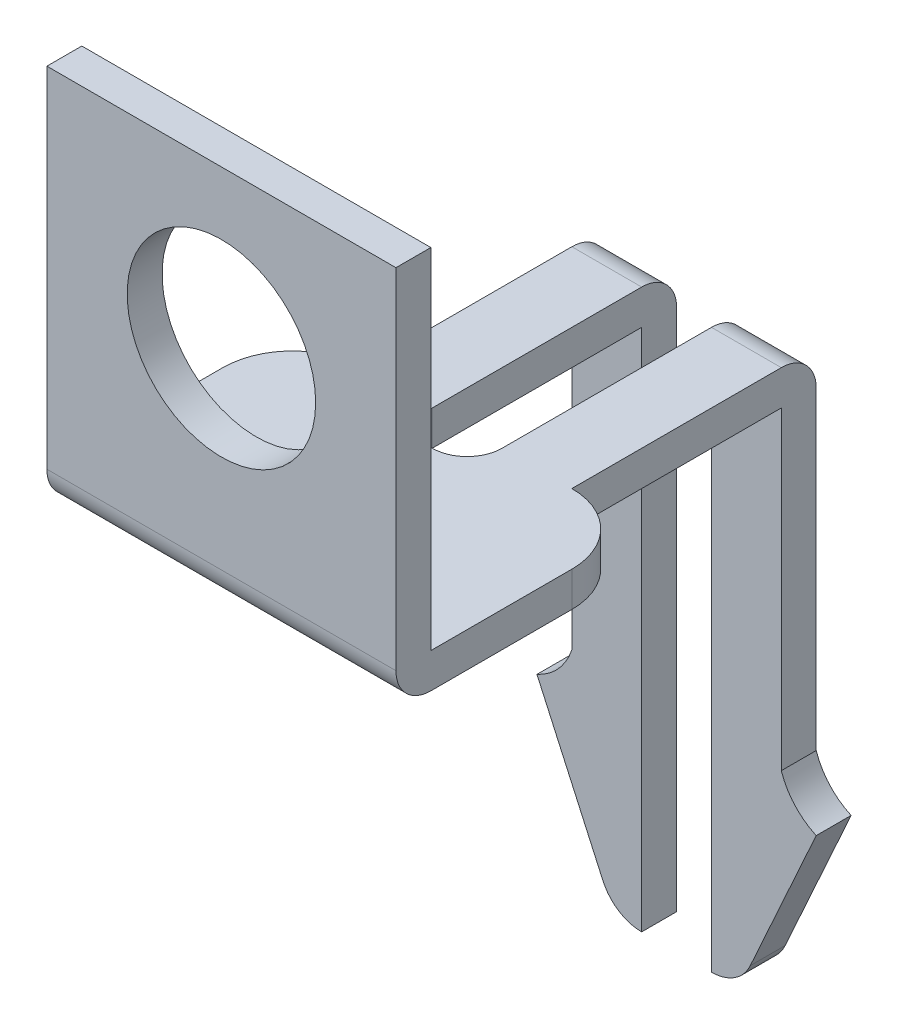
ISO-10303-21;
HEADER;
FILE_DESCRIPTION(('STEP AP214'),'2;1');
FILE_NAME('part.step','',(''),(''),'','','');
FILE_SCHEMA(('AUTOMOTIVE_DESIGN { 1 0 10303 214 1 1 1 1 }'));
ENDSEC;
DATA;
#1=APPLICATION_CONTEXT('core data for automotive mechanical design processes');
#2=APPLICATION_PROTOCOL_DEFINITION('international standard','automotive_design',2000,#1);
#3=PRODUCT_CONTEXT('',#1,'mechanical');
#4=PRODUCT('Part','Part','',(#3));
#5=PRODUCT_RELATED_PRODUCT_CATEGORY('part','',(#4));
#6=PRODUCT_DEFINITION_FORMATION('','',#4);
#7=PRODUCT_DEFINITION_CONTEXT('part definition',#1,'design');
#8=PRODUCT_DEFINITION('design','',#6,#7);
#9=PRODUCT_DEFINITION_SHAPE('','',#8);
#10=(LENGTH_UNIT() NAMED_UNIT(*) SI_UNIT(.MILLI.,.METRE.));
#11=(NAMED_UNIT(*) PLANE_ANGLE_UNIT() SI_UNIT($,.RADIAN.));
#12=(NAMED_UNIT(*) SI_UNIT($,.STERADIAN.) SOLID_ANGLE_UNIT());
#13=UNCERTAINTY_MEASURE_WITH_UNIT(LENGTH_MEASURE(1.E-05),#10,'distance_accuracy_value','');
#14=(GEOMETRIC_REPRESENTATION_CONTEXT(3) GLOBAL_UNCERTAINTY_ASSIGNED_CONTEXT((#13)) GLOBAL_UNIT_ASSIGNED_CONTEXT((#10,
#11,#12)) REPRESENTATION_CONTEXT('',''));
#15=CARTESIAN_POINT('',(0.,0.,0.));
#16=DIRECTION('',(0.,0.,1.));
#17=DIRECTION('',(1.,0.,0.));
#18=AXIS2_PLACEMENT_3D('',#15,#16,#17);
#19=CARTESIAN_POINT('',(0.,0.,-7.02));
#20=DIRECTION('',(0.,0.,1.));
#21=DIRECTION('',(1.,0.,0.));
#22=AXIS2_PLACEMENT_3D('',#19,#20,#21);
#23=PLANE('',#22);
#24=CARTESIAN_POINT('',(2.38440198337204,-6.9561141946464,-7.02));
#25=DIRECTION('',(0.,0.,1.));
#26=DIRECTION('',(-1.,0.,0.));
#27=AXIS2_PLACEMENT_3D('',#24,#25,#26);
#28=CIRCLE('',#27,0.931952646211558);
#29=CARTESIAN_POINT('',(1.5,-7.25,-7.02));
#30=VERTEX_POINT('',#29);
#31=CARTESIAN_POINT('',(1.99999999999999,-7.80509643825363,-7.02));
#32=VERTEX_POINT('',#31);
#33=EDGE_CURVE('E224',#30,#32,#28,.T.);
#34=ORIENTED_EDGE('',*,*,#33,.T.);
#35=DIRECTION('',(-0.412469437084235,-0.91097143943782,0.));
#36=VECTOR('',#35,1.);
#37=CARTESIAN_POINT('',(1.05509643825363,-9.89199083668204,-7.02));
#38=LINE('',#37,#36);
#39=CARTESIAN_POINT('',(1.05509643825363,-9.89199083668204,-7.02));
#40=VERTEX_POINT('',#39);
#41=EDGE_CURVE('E223',#32,#40,#38,.T.);
#42=ORIENTED_EDGE('',*,*,#41,.T.);
#43=CARTESIAN_POINT('',(0.499999999999999,-9.6406544001026,-7.02));
#44=DIRECTION('',(0.,0.,-1.));
#45=DIRECTION('',(1.,0.,0.));
#46=AXIS2_PLACEMENT_3D('',#43,#44,#45);
#47=CIRCLE('',#46,0.609345599897395);
#48=CARTESIAN_POINT('',(0.499999999999999,-10.25,-7.02));
#49=VERTEX_POINT('',#48);
#50=EDGE_CURVE('E207',#40,#49,#47,.T.);
#51=ORIENTED_EDGE('',*,*,#50,.T.);
#52=DIRECTION('',(0.,1.,0.));
#53=VECTOR('',#52,1.);
#54=CARTESIAN_POINT('',(0.5,-2.75,-7.02));
#55=LINE('',#54,#53);
#56=CARTESIAN_POINT('',(0.5,-2.75,-7.02));
#57=VERTEX_POINT('',#56);
#58=EDGE_CURVE('E220',#49,#57,#55,.T.);
#59=ORIENTED_EDGE('',*,*,#58,.T.);
#60=DIRECTION('',(1.,0.,0.));
#61=VECTOR('',#60,1.);
#62=CARTESIAN_POINT('',(0.,-2.75,-7.02));
#63=LINE('',#62,#61);
#64=CARTESIAN_POINT('',(1.5,-2.75,-7.02));
#65=VERTEX_POINT('',#64);
#66=EDGE_CURVE('E280',#57,#65,#63,.T.);
#67=ORIENTED_EDGE('',*,*,#66,.T.);
#68=DIRECTION('',(0.,1.,0.));
#69=VECTOR('',#68,1.);
#70=CARTESIAN_POINT('',(1.5,-2.75,-7.02));
#71=LINE('',#70,#69);
#72=EDGE_CURVE('E284',#30,#65,#71,.T.);
#73=ORIENTED_EDGE('',*,*,#72,.F.);
#74=EDGE_LOOP('',(#34,#42,#51,#59,#67,#73));
#75=FACE_BOUND('',#74,.T.);
#76=ADVANCED_FACE('F35',(#75),#23,.F.);
#77=CARTESIAN_POINT('',(1.5,-10.25,-6.52));
#78=DIRECTION('',(0.,0.,1.));
#79=DIRECTION('',(1.,0.,0.));
#80=AXIS2_PLACEMENT_3D('',#77,#78,#79);
#81=PLANE('',#80);
#82=DIRECTION('',(0.412469437084235,0.910971439437821,0.));
#83=VECTOR('',#82,1.);
#84=CARTESIAN_POINT('',(0.996267159368278,-10.02191996124,-6.52));
#85=LINE('',#84,#83);
#86=CARTESIAN_POINT('',(1.05509643825363,-9.89199083668204,-6.52));
#87=VERTEX_POINT('',#86);
#88=CARTESIAN_POINT('',(1.99999999999999,-7.80509643825363,-6.52));
#89=VERTEX_POINT('',#88);
#90=EDGE_CURVE('E11',#87,#89,#85,.T.);
#91=ORIENTED_EDGE('',*,*,#90,.T.);
#92=CARTESIAN_POINT('',(2.38440198337204,-6.9561141946464,-6.52));
#93=DIRECTION('',(0.,0.,1.));
#94=DIRECTION('',(1.,0.,0.));
#95=AXIS2_PLACEMENT_3D('',#92,#93,#94);
#96=CIRCLE('',#95,0.931952646211558);
#97=CARTESIAN_POINT('',(1.5,-7.25,-6.52));
#98=VERTEX_POINT('',#97);
#99=EDGE_CURVE('E547',#89,#98,#96,.F.);
#100=ORIENTED_EDGE('',*,*,#99,.T.);
#101=DIRECTION('',(0.,1.,0.));
#102=VECTOR('',#101,1.);
#103=CARTESIAN_POINT('',(1.5,-10.25,-6.52));
#104=LINE('',#103,#102);
#105=CARTESIAN_POINT('',(1.5,-2.75,-6.52));
#106=VERTEX_POINT('',#105);
#107=EDGE_CURVE('E339',#98,#106,#104,.T.);
#108=ORIENTED_EDGE('',*,*,#107,.T.);
#109=DIRECTION('',(1.,0.,0.));
#110=VECTOR('',#109,1.);
#111=CARTESIAN_POINT('',(1.5,-2.75,-6.52));
#112=LINE('',#111,#110);
#113=CARTESIAN_POINT('',(0.5,-2.75,-6.52));
#114=VERTEX_POINT('',#113);
#115=EDGE_CURVE('E215',#114,#106,#112,.T.);
#116=ORIENTED_EDGE('',*,*,#115,.F.);
#117=DIRECTION('',(0.,1.,0.));
#118=VECTOR('',#117,1.);
#119=CARTESIAN_POINT('',(0.499999999999999,-10.25,-6.52));
#120=LINE('',#119,#118);
#121=CARTESIAN_POINT('',(0.499999999999999,-10.25,-6.52));
#122=VERTEX_POINT('',#121);
#123=EDGE_CURVE('E214',#122,#114,#120,.T.);
#124=ORIENTED_EDGE('',*,*,#123,.F.);
#125=CARTESIAN_POINT('',(0.499999999999999,-9.6406544001026,-6.52));
#126=DIRECTION('',(0.,0.,1.));
#127=DIRECTION('',(1.,0.,0.));
#128=AXIS2_PLACEMENT_3D('',#125,#126,#127);
#129=CIRCLE('',#128,0.609345599897395);
#130=EDGE_CURVE('E210',#122,#87,#129,.T.);
#131=ORIENTED_EDGE('',*,*,#130,.T.);
#132=EDGE_LOOP('',(#91,#100,#108,#116,#124,#131));
#133=FACE_BOUND('',#132,.T.);
#134=ADVANCED_FACE('F301',(#133),#81,.T.);
#135=CARTESIAN_POINT('',(1.5,-2.75,-7.02));
#136=DIRECTION('',(-1.,0.,0.));
#137=DIRECTION('',(0.,0.,1.));
#138=AXIS2_PLACEMENT_3D('',#135,#136,#137);
#139=PLANE('',#138);
#140=DIRECTION('',(0.,0.,1.));
#141=VECTOR('',#140,1.);
#142=CARTESIAN_POINT('',(1.5,-7.25,-7.02));
#143=LINE('',#142,#141);
#144=EDGE_CURVE('E493',#30,#98,#143,.T.);
#145=ORIENTED_EDGE('',*,*,#144,.F.);
#146=ORIENTED_EDGE('',*,*,#72,.T.);
#147=CARTESIAN_POINT('',(1.5,-2.75,-6.52));
#148=DIRECTION('',(-1.,0.,0.));
#149=DIRECTION('',(0.,0.,1.));
#150=AXIS2_PLACEMENT_3D('',#147,#148,#149);
#151=CIRCLE('',#150,0.5);
#152=CARTESIAN_POINT('',(1.5,-2.25,-6.52));
#153=VERTEX_POINT('',#152);
#154=EDGE_CURVE('E58',#65,#153,#151,.F.);
#155=ORIENTED_EDGE('',*,*,#154,.T.);
#156=DIRECTION('',(0.,0.,1.));
#157=VECTOR('',#156,1.);
#158=CARTESIAN_POINT('',(1.5,-2.25,-7.02));
#159=LINE('',#158,#157);
#160=CARTESIAN_POINT('',(1.5,-2.25,-3.52));
#161=VERTEX_POINT('',#160);
#162=EDGE_CURVE('E375',#153,#161,#159,.T.);
#163=ORIENTED_EDGE('',*,*,#162,.T.);
#164=DIRECTION('',(0.,1.,0.));
#165=VECTOR('',#164,1.);
#166=CARTESIAN_POINT('',(1.5,-2.75,-3.52));
#167=LINE('',#166,#165);
#168=CARTESIAN_POINT('',(1.5,-2.75,-3.52));
#169=VERTEX_POINT('',#168);
#170=EDGE_CURVE('E392',#169,#161,#167,.T.);
#171=ORIENTED_EDGE('',*,*,#170,.F.);
#172=DIRECTION('',(0.,0.,1.));
#173=VECTOR('',#172,1.);
#174=CARTESIAN_POINT('',(1.5,-2.75,-7.02));
#175=LINE('',#174,#173);
#176=EDGE_CURVE('E380',#106,#169,#175,.T.);
#177=ORIENTED_EDGE('',*,*,#176,.F.);
#178=ORIENTED_EDGE('',*,*,#107,.F.);
#179=EDGE_LOOP('',(#145,#146,#155,#163,#171,#177,#178));
#180=FACE_BOUND('',#179,.T.);
#181=ADVANCED_FACE('F307',(#180),#139,.F.);
#182=CARTESIAN_POINT('',(-2.5,-2.75,-0.5));
#183=DIRECTION('',(0.,-1.,0.));
#184=DIRECTION('',(1.,0.,0.));
#185=AXIS2_PLACEMENT_3D('',#182,#183,#184);
#186=PLANE('',#185);
#187=ORIENTED_EDGE('',*,*,#115,.T.);
#188=ORIENTED_EDGE('',*,*,#176,.T.);
#189=CARTESIAN_POINT('',(1.5,-2.75,-2.52));
#190=DIRECTION('',(0.,-1.,0.));
#191=DIRECTION('',(0.,0.,-1.));
#192=AXIS2_PLACEMENT_3D('',#189,#190,#191);
#193=CIRCLE('',#192,1.);
#194=CARTESIAN_POINT('',(2.5,-2.75,-2.52));
#195=VERTEX_POINT('',#194);
#196=EDGE_CURVE('E382',#169,#195,#193,.T.);
#197=ORIENTED_EDGE('',*,*,#196,.T.);
#198=DIRECTION('',(0.,0.,1.));
#199=VECTOR('',#198,1.);
#200=CARTESIAN_POINT('',(2.5,-2.75,-0.5));
#201=LINE('',#200,#199);
#202=CARTESIAN_POINT('',(2.5,-2.75,-0.5));
#203=VERTEX_POINT('',#202);
#204=EDGE_CURVE('E458',#195,#203,#201,.T.);
#205=ORIENTED_EDGE('',*,*,#204,.T.);
#206=DIRECTION('',(1.,0.,0.));
#207=VECTOR('',#206,1.);
#208=CARTESIAN_POINT('',(-2.5,-2.75,-0.5));
#209=LINE('',#208,#207);
#210=CARTESIAN_POINT('',(-2.5,-2.75,-0.5));
#211=VERTEX_POINT('',#210);
#212=EDGE_CURVE('E466',#203,#211,#209,.F.);
#213=ORIENTED_EDGE('',*,*,#212,.T.);
#214=DIRECTION('',(0.,0.,1.));
#215=VECTOR('',#214,1.);
#216=CARTESIAN_POINT('',(-2.5,-2.75,-0.5));
#217=LINE('',#216,#215);
#218=CARTESIAN_POINT('',(-2.5,-2.75,-2.52));
#219=VERTEX_POINT('',#218);
#220=EDGE_CURVE('E444',#219,#211,#217,.T.);
#221=ORIENTED_EDGE('',*,*,#220,.F.);
#222=CARTESIAN_POINT('',(-1.5,-2.75,-2.52));
#223=DIRECTION('',(0.,1.,0.));
#224=DIRECTION('',(0.,0.,-1.));
#225=AXIS2_PLACEMENT_3D('',#222,#223,#224);
#226=CIRCLE('',#225,1.);
#227=CARTESIAN_POINT('',(-1.5,-2.75,-3.52));
#228=VERTEX_POINT('',#227);
#229=EDGE_CURVE('E364',#228,#219,#226,.T.);
#230=ORIENTED_EDGE('',*,*,#229,.F.);
#231=DIRECTION('',(0.,0.,1.));
#232=VECTOR('',#231,1.);
#233=CARTESIAN_POINT('',(-1.5,-2.75,-7.02));
#234=LINE('',#233,#232);
#235=CARTESIAN_POINT('',(-1.5,-2.75,-6.52));
#236=VERTEX_POINT('',#235);
#237=EDGE_CURVE('E366',#236,#228,#234,.T.);
#238=ORIENTED_EDGE('',*,*,#237,.F.);
#239=DIRECTION('',(-1.,0.,0.));
#240=VECTOR('',#239,1.);
#241=CARTESIAN_POINT('',(-1.5,-2.75,-6.52));
#242=LINE('',#241,#240);
#243=CARTESIAN_POINT('',(-0.5,-2.75,-6.52));
#244=VERTEX_POINT('',#243);
#245=EDGE_CURVE('E354',#244,#236,#242,.T.);
#246=ORIENTED_EDGE('',*,*,#245,.F.);
#247=DIRECTION('',(0.,0.,1.));
#248=VECTOR('',#247,1.);
#249=CARTESIAN_POINT('',(-0.5,-2.75,-7.02));
#250=LINE('',#249,#248);
#251=CARTESIAN_POINT('',(-0.5,-2.75,-3.52));
#252=VERTEX_POINT('',#251);
#253=EDGE_CURVE('E396',#244,#252,#250,.T.);
#254=ORIENTED_EDGE('',*,*,#253,.T.);
#255=CARTESIAN_POINT('',(0.,-2.75,-3.52));
#256=DIRECTION('',(0.,1.,0.));
#257=DIRECTION('',(0.,0.,1.));
#258=AXIS2_PLACEMENT_3D('',#255,#256,#257);
#259=CIRCLE('',#258,0.5);
#260=CARTESIAN_POINT('',(0.5,-2.75,-3.52));
#261=VERTEX_POINT('',#260);
#262=EDGE_CURVE('E398',#252,#261,#259,.T.);
#263=ORIENTED_EDGE('',*,*,#262,.T.);
#264=DIRECTION('',(0.,0.,-1.));
#265=VECTOR('',#264,1.);
#266=CARTESIAN_POINT('',(0.5,-2.75,-3.52));
#267=LINE('',#266,#265);
#268=EDGE_CURVE('E245',#261,#114,#267,.T.);
#269=ORIENTED_EDGE('',*,*,#268,.T.);
#270=EDGE_LOOP('',(#187,#188,#197,#205,#213,#221,#230,#238,#246,#254,#263,#269));
#271=FACE_BOUND('',#270,.T.);
#272=ADVANCED_FACE('F323',(#271),#186,.T.);
#273=CARTESIAN_POINT('',(2.5,-2.25,-7.02));
#274=DIRECTION('',(0.,-1.,0.));
#275=DIRECTION('',(0.,0.,-1.));
#276=AXIS2_PLACEMENT_3D('',#273,#274,#275);
#277=PLANE('',#276);
#278=ORIENTED_EDGE('',*,*,#162,.F.);
#279=DIRECTION('',(1.,0.,0.));
#280=VECTOR('',#279,1.);
#281=CARTESIAN_POINT('',(2.5,-2.25,-6.52));
#282=LINE('',#281,#280);
#283=CARTESIAN_POINT('',(0.5,-2.25,-6.52));
#284=VERTEX_POINT('',#283);
#285=EDGE_CURVE('E50',#153,#284,#282,.F.);
#286=ORIENTED_EDGE('',*,*,#285,.T.);
#287=DIRECTION('',(0.,0.,-1.));
#288=VECTOR('',#287,1.);
#289=CARTESIAN_POINT('',(0.5,-2.25,-3.52));
#290=LINE('',#289,#288);
#291=CARTESIAN_POINT('',(0.5,-2.25,-3.52));
#292=VERTEX_POINT('',#291);
#293=EDGE_CURVE('E238',#292,#284,#290,.T.);
#294=ORIENTED_EDGE('',*,*,#293,.F.);
#295=CARTESIAN_POINT('',(0.,-2.25,-3.52));
#296=DIRECTION('',(0.,1.,0.));
#297=DIRECTION('',(0.,0.,1.));
#298=AXIS2_PLACEMENT_3D('',#295,#296,#297);
#299=CIRCLE('',#298,0.5);
#300=CARTESIAN_POINT('',(-0.5,-2.25,-3.52));
#301=VERTEX_POINT('',#300);
#302=EDGE_CURVE('E403',#301,#292,#299,.T.);
#303=ORIENTED_EDGE('',*,*,#302,.F.);
#304=DIRECTION('',(0.,0.,1.));
#305=VECTOR('',#304,1.);
#306=CARTESIAN_POINT('',(-0.5,-2.25,-7.02));
#307=LINE('',#306,#305);
#308=CARTESIAN_POINT('',(-0.5,-2.25,-6.52));
#309=VERTEX_POINT('',#308);
#310=EDGE_CURVE('E391',#309,#301,#307,.T.);
#311=ORIENTED_EDGE('',*,*,#310,.F.);
#312=DIRECTION('',(1.,0.,0.));
#313=VECTOR('',#312,1.);
#314=CARTESIAN_POINT('',(2.5,-2.25,-6.52));
#315=LINE('',#314,#313);
#316=CARTESIAN_POINT('',(-1.5,-2.25,-6.52));
#317=VERTEX_POINT('',#316);
#318=EDGE_CURVE('E272',#309,#317,#315,.F.);
#319=ORIENTED_EDGE('',*,*,#318,.T.);
#320=DIRECTION('',(0.,0.,1.));
#321=VECTOR('',#320,1.);
#322=CARTESIAN_POINT('',(-1.5,-2.25,-7.02));
#323=LINE('',#322,#321);
#324=CARTESIAN_POINT('',(-1.5,-2.25,-3.52));
#325=VERTEX_POINT('',#324);
#326=EDGE_CURVE('E367',#317,#325,#323,.T.);
#327=ORIENTED_EDGE('',*,*,#326,.T.);
#328=CARTESIAN_POINT('',(-1.5,-2.25,-2.52));
#329=DIRECTION('',(0.,1.,0.));
#330=DIRECTION('',(0.,0.,-1.));
#331=AXIS2_PLACEMENT_3D('',#328,#329,#330);
#332=CIRCLE('',#331,1.);
#333=CARTESIAN_POINT('',(-2.5,-2.25,-2.52));
#334=VERTEX_POINT('',#333);
#335=EDGE_CURVE('E363',#325,#334,#332,.T.);
#336=ORIENTED_EDGE('',*,*,#335,.T.);
#337=DIRECTION('',(0.,0.,1.));
#338=VECTOR('',#337,1.);
#339=CARTESIAN_POINT('',(-2.5,-2.25,-7.02));
#340=LINE('',#339,#338);
#341=CARTESIAN_POINT('',(-2.5,-2.25,-0.5));
#342=VERTEX_POINT('',#341);
#343=EDGE_CURVE('E262',#334,#342,#340,.T.);
#344=ORIENTED_EDGE('',*,*,#343,.T.);
#345=DIRECTION('',(1.,0.,0.));
#346=VECTOR('',#345,1.);
#347=CARTESIAN_POINT('',(2.5,-2.25,-0.5));
#348=LINE('',#347,#346);
#349=CARTESIAN_POINT('',(2.5,-2.25,-0.5));
#350=VERTEX_POINT('',#349);
#351=EDGE_CURVE('E229',#342,#350,#348,.T.);
#352=ORIENTED_EDGE('',*,*,#351,.T.);
#353=DIRECTION('',(0.,0.,1.));
#354=VECTOR('',#353,1.);
#355=CARTESIAN_POINT('',(2.5,-2.25,-7.02));
#356=LINE('',#355,#354);
#357=CARTESIAN_POINT('',(2.5,-2.25,-2.52));
#358=VERTEX_POINT('',#357);
#359=EDGE_CURVE('E233',#358,#350,#356,.T.);
#360=ORIENTED_EDGE('',*,*,#359,.F.);
#361=CARTESIAN_POINT('',(1.5,-2.25,-2.52));
#362=DIRECTION('',(0.,-1.,0.));
#363=DIRECTION('',(0.,0.,-1.));
#364=AXIS2_PLACEMENT_3D('',#361,#362,#363);
#365=CIRCLE('',#364,1.);
#366=EDGE_CURVE('E383',#161,#358,#365,.T.);
#367=ORIENTED_EDGE('',*,*,#366,.F.);
#368=EDGE_LOOP('',(#278,#286,#294,#303,#311,#319,#327,#336,#344,#352,#360,#367));
#369=FACE_BOUND('',#368,.T.);
#370=ADVANCED_FACE('F314',(#369),#277,.F.);
#371=DIRECTION('',(0.412469437084235,-0.91097143943782,0.));
#372=VECTOR('',#371,1.);
#373=CARTESIAN_POINT('',(-1.05509643825363,-9.89199083668204,-7.02));
#374=LINE('',#373,#372);
#375=CARTESIAN_POINT('',(-1.99999999999999,-7.80509643825363,-7.02));
#376=VERTEX_POINT('',#375);
#377=CARTESIAN_POINT('',(-1.05509643825363,-9.89199083668204,-7.02));
#378=VERTEX_POINT('',#377);
#379=EDGE_CURVE('E328',#376,#378,#374,.T.);
#380=ORIENTED_EDGE('',*,*,#379,.F.);
#381=CARTESIAN_POINT('',(-2.38440198337204,-6.9561141946464,-7.02));
#382=DIRECTION('',(0.,0.,-1.));
#383=DIRECTION('',(1.,0.,0.));
#384=AXIS2_PLACEMENT_3D('',#381,#382,#383);
#385=CIRCLE('',#384,0.931952646211558);
#386=CARTESIAN_POINT('',(-1.5,-7.25,-7.02));
#387=VERTEX_POINT('',#386);
#388=EDGE_CURVE('E330',#387,#376,#385,.T.);
#389=ORIENTED_EDGE('',*,*,#388,.F.);
#390=DIRECTION('',(0.,1.,0.));
#391=VECTOR('',#390,1.);
#392=CARTESIAN_POINT('',(-1.5,-2.75,-7.02));
#393=LINE('',#392,#391);
#394=CARTESIAN_POINT('',(-1.5,-2.75,-7.02));
#395=VERTEX_POINT('',#394);
#396=EDGE_CURVE('E373',#387,#395,#393,.T.);
#397=ORIENTED_EDGE('',*,*,#396,.T.);
#398=DIRECTION('',(1.,0.,0.));
#399=VECTOR('',#398,1.);
#400=CARTESIAN_POINT('',(0.,-2.75,-7.02));
#401=LINE('',#400,#399);
#402=CARTESIAN_POINT('',(-0.5,-2.75,-7.02));
#403=VERTEX_POINT('',#402);
#404=EDGE_CURVE('E267',#395,#403,#401,.T.);
#405=ORIENTED_EDGE('',*,*,#404,.T.);
#406=DIRECTION('',(0.,1.,0.));
#407=VECTOR('',#406,1.);
#408=CARTESIAN_POINT('',(-0.5,-2.75,-7.02));
#409=LINE('',#408,#407);
#410=CARTESIAN_POINT('',(-0.499999999999999,-10.25,-7.02));
#411=VERTEX_POINT('',#410);
#412=EDGE_CURVE('E243',#411,#403,#409,.T.);
#413=ORIENTED_EDGE('',*,*,#412,.F.);
#414=CARTESIAN_POINT('',(-0.499999999999999,-9.6406544001026,-7.02));
#415=DIRECTION('',(0.,0.,1.));
#416=DIRECTION('',(-1.,0.,0.));
#417=AXIS2_PLACEMENT_3D('',#414,#415,#416);
#418=CIRCLE('',#417,0.609345599897395);
#419=EDGE_CURVE('E333',#378,#411,#418,.T.);
#420=ORIENTED_EDGE('',*,*,#419,.F.);
#421=EDGE_LOOP('',(#380,#389,#397,#405,#413,#420));
#422=FACE_BOUND('',#421,.T.);
#423=ADVANCED_FACE('F303',(#422),#23,.F.);
#424=CARTESIAN_POINT('',(0.,0.,-0.5));
#425=DIRECTION('',(0.,0.,1.));
#426=DIRECTION('',(1.,0.,0.));
#427=AXIS2_PLACEMENT_3D('',#424,#425,#426);
#428=PLANE('',#427);
#429=CARTESIAN_POINT('',(0.,0.5,-0.5));
#430=DIRECTION('',(0.,0.,1.));
#431=DIRECTION('',(1.,0.,0.));
#432=AXIS2_PLACEMENT_3D('',#429,#430,#431);
#433=CIRCLE('',#432,1.35);
#434=CARTESIAN_POINT('',(1.35,0.5,-0.5));
#435=VERTEX_POINT('',#434);
#436=EDGE_CURVE('E248',#435,#435,#433,.T.);
#437=ORIENTED_EDGE('',*,*,#436,.T.);
#438=EDGE_LOOP('',(#437));
#439=FACE_BOUND('',#438,.T.);
#440=ORIENTED_EDGE('',*,*,#351,.F.);
#441=DIRECTION('',(0.,-1.,0.));
#442=VECTOR('',#441,1.);
#443=CARTESIAN_POINT('',(-2.5,2.75,-0.5));
#444=LINE('',#443,#442);
#445=CARTESIAN_POINT('',(-2.5,2.75,-0.5));
#446=VERTEX_POINT('',#445);
#447=EDGE_CURVE('E431',#446,#342,#444,.T.);
#448=ORIENTED_EDGE('',*,*,#447,.F.);
#449=DIRECTION('',(-1.,0.,0.));
#450=VECTOR('',#449,1.);
#451=CARTESIAN_POINT('',(-2.5,2.75,-0.5));
#452=LINE('',#451,#450);
#453=CARTESIAN_POINT('',(2.5,2.75,-0.5));
#454=VERTEX_POINT('',#453);
#455=EDGE_CURVE('E438',#454,#446,#452,.T.);
#456=ORIENTED_EDGE('',*,*,#455,.F.);
#457=DIRECTION('',(0.,1.,0.));
#458=VECTOR('',#457,1.);
#459=CARTESIAN_POINT('',(2.5,2.75,-0.5));
#460=LINE('',#459,#458);
#461=EDGE_CURVE('E252',#350,#454,#460,.T.);
#462=ORIENTED_EDGE('',*,*,#461,.F.);
#463=EDGE_LOOP('',(#440,#448,#456,#462));
#464=FACE_BOUND('',#463,.T.);
#465=ADVANCED_FACE('F313',(#439,#464),#428,.F.);
#466=CARTESIAN_POINT('',(-2.5,2.75,-0.5));
#467=DIRECTION('',(-1.,0.,0.));
#468=DIRECTION('',(0.,0.,1.));
#469=AXIS2_PLACEMENT_3D('',#466,#467,#468);
#470=PLANE('',#469);
#471=DIRECTION('',(0.,1.,0.));
#472=VECTOR('',#471,1.);
#473=CARTESIAN_POINT('',(-2.5,-2.75,-2.52));
#474=LINE('',#473,#472);
#475=EDGE_CURVE('E369',#219,#334,#474,.T.);
#476=ORIENTED_EDGE('',*,*,#475,.F.);
#477=ORIENTED_EDGE('',*,*,#220,.T.);
#478=CARTESIAN_POINT('',(-2.5,-2.25,-0.5));
#479=DIRECTION('',(-1.,0.,0.));
#480=DIRECTION('',(0.,0.,1.));
#481=AXIS2_PLACEMENT_3D('',#478,#479,#480);
#482=CIRCLE('',#481,0.5);
#483=CARTESIAN_POINT('',(-2.5,-2.25,0.));
#484=VERTEX_POINT('',#483);
#485=EDGE_CURVE('E263',#211,#484,#482,.T.);
#486=ORIENTED_EDGE('',*,*,#485,.T.);
#487=DIRECTION('',(0.,-1.,0.));
#488=VECTOR('',#487,1.);
#489=CARTESIAN_POINT('',(-2.5,2.75,0.));
#490=LINE('',#489,#488);
#491=CARTESIAN_POINT('',(-2.5,2.75,0.));
#492=VERTEX_POINT('',#491);
#493=EDGE_CURVE('E450',#492,#484,#490,.T.);
#494=ORIENTED_EDGE('',*,*,#493,.F.);
#495=DIRECTION('',(0.,0.,1.));
#496=VECTOR('',#495,1.);
#497=CARTESIAN_POINT('',(-2.5,2.75,-0.5));
#498=LINE('',#497,#496);
#499=EDGE_CURVE('E433',#446,#492,#498,.T.);
#500=ORIENTED_EDGE('',*,*,#499,.F.);
#501=ORIENTED_EDGE('',*,*,#447,.T.);
#502=ORIENTED_EDGE('',*,*,#343,.F.);
#503=EDGE_LOOP('',(#476,#477,#486,#494,#500,#501,#502));
#504=FACE_BOUND('',#503,.T.);
#505=ADVANCED_FACE('F320',(#504),#470,.T.);
#506=CARTESIAN_POINT('',(-2.5,2.75,-0.5));
#507=DIRECTION('',(0.,1.,0.));
#508=DIRECTION('',(-1.,0.,0.));
#509=AXIS2_PLACEMENT_3D('',#506,#507,#508);
#510=PLANE('',#509);
#511=DIRECTION('',(-1.,0.,0.));
#512=VECTOR('',#511,1.);
#513=CARTESIAN_POINT('',(-2.5,2.75,0.));
#514=LINE('',#513,#512);
#515=CARTESIAN_POINT('',(2.5,2.75,0.));
#516=VERTEX_POINT('',#515);
#517=EDGE_CURVE('E437',#516,#492,#514,.T.);
#518=ORIENTED_EDGE('',*,*,#517,.F.);
#519=DIRECTION('',(0.,0.,1.));
#520=VECTOR('',#519,1.);
#521=CARTESIAN_POINT('',(2.5,2.75,-0.5));
#522=LINE('',#521,#520);
#523=EDGE_CURVE('E456',#454,#516,#522,.T.);
#524=ORIENTED_EDGE('',*,*,#523,.F.);
#525=ORIENTED_EDGE('',*,*,#455,.T.);
#526=ORIENTED_EDGE('',*,*,#499,.T.);
#527=EDGE_LOOP('',(#518,#524,#525,#526));
#528=FACE_BOUND('',#527,.T.);
#529=ADVANCED_FACE('F482',(#528),#510,.T.);
#530=CARTESIAN_POINT('',(2.5,2.75,-0.5));
#531=DIRECTION('',(1.,0.,0.));
#532=DIRECTION('',(0.,0.,-1.));
#533=AXIS2_PLACEMENT_3D('',#530,#531,#532);
#534=PLANE('',#533);
#535=DIRECTION('',(0.,1.,0.));
#536=VECTOR('',#535,1.);
#537=CARTESIAN_POINT('',(2.5,-2.75,-2.52));
#538=LINE('',#537,#536);
#539=EDGE_CURVE('E388',#195,#358,#538,.T.);
#540=ORIENTED_EDGE('',*,*,#539,.T.);
#541=ORIENTED_EDGE('',*,*,#359,.T.);
#542=ORIENTED_EDGE('',*,*,#461,.T.);
#543=ORIENTED_EDGE('',*,*,#523,.T.);
#544=DIRECTION('',(0.,1.,0.));
#545=VECTOR('',#544,1.);
#546=CARTESIAN_POINT('',(2.5,2.75,0.));
#547=LINE('',#546,#545);
#548=CARTESIAN_POINT('',(2.5,-2.25,0.));
#549=VERTEX_POINT('',#548);
#550=EDGE_CURVE('E440',#549,#516,#547,.T.);
#551=ORIENTED_EDGE('',*,*,#550,.F.);
#552=CARTESIAN_POINT('',(2.5,-2.25,-0.5));
#553=DIRECTION('',(1.,0.,0.));
#554=DIRECTION('',(0.,0.,-1.));
#555=AXIS2_PLACEMENT_3D('',#552,#553,#554);
#556=CIRCLE('',#555,0.5);
#557=EDGE_CURVE('E469',#549,#203,#556,.T.);
#558=ORIENTED_EDGE('',*,*,#557,.T.);
#559=ORIENTED_EDGE('',*,*,#204,.F.);
#560=EDGE_LOOP('',(#540,#541,#542,#543,#551,#558,#559));
#561=FACE_BOUND('',#560,.T.);
#562=ADVANCED_FACE('F477',(#561),#534,.T.);
#563=CARTESIAN_POINT('',(0.,0.,0.));
#564=DIRECTION('',(0.,0.,1.));
#565=DIRECTION('',(1.,0.,0.));
#566=AXIS2_PLACEMENT_3D('',#563,#564,#565);
#567=PLANE('',#566);
#568=CARTESIAN_POINT('',(0.,0.5,0.));
#569=DIRECTION('',(0.,0.,1.));
#570=DIRECTION('',(1.,0.,0.));
#571=AXIS2_PLACEMENT_3D('',#568,#569,#570);
#572=CIRCLE('',#571,1.35);
#573=CARTESIAN_POINT('',(1.35,0.5,0.));
#574=VERTEX_POINT('',#573);
#575=EDGE_CURVE('E266',#574,#574,#572,.T.);
#576=ORIENTED_EDGE('',*,*,#575,.F.);
#577=EDGE_LOOP('',(#576));
#578=FACE_BOUND('',#577,.T.);
#579=ORIENTED_EDGE('',*,*,#493,.T.);
#580=DIRECTION('',(1.,0.,0.));
#581=VECTOR('',#580,1.);
#582=CARTESIAN_POINT('',(0.,-2.25,0.));
#583=LINE('',#582,#581);
#584=EDGE_CURVE('E455',#484,#549,#583,.T.);
#585=ORIENTED_EDGE('',*,*,#584,.T.);
#586=ORIENTED_EDGE('',*,*,#550,.T.);
#587=ORIENTED_EDGE('',*,*,#517,.T.);
#588=EDGE_LOOP('',(#579,#585,#586,#587));
#589=FACE_BOUND('',#588,.T.);
#590=ADVANCED_FACE('F480',(#578,#589),#567,.T.);
#591=CARTESIAN_POINT('',(0.,0.5,-0.5));
#592=DIRECTION('',(0.,0.,1.));
#593=DIRECTION('',(1.,0.,0.));
#594=AXIS2_PLACEMENT_3D('',#591,#592,#593);
#595=CYLINDRICAL_SURFACE('',#594,1.35);
#596=ORIENTED_EDGE('',*,*,#436,.F.);
#597=EDGE_LOOP('',(#596));
#598=FACE_BOUND('',#597,.T.);
#599=ORIENTED_EDGE('',*,*,#575,.T.);
#600=EDGE_LOOP('',(#599));
#601=FACE_BOUND('',#600,.T.);
#602=ADVANCED_FACE('F724',(#598,#601),#595,.F.);
#603=CARTESIAN_POINT('',(0.,-2.25,-0.5));
#604=DIRECTION('',(1.,0.,0.));
#605=DIRECTION('',(0.,1.,0.));
#606=AXIS2_PLACEMENT_3D('',#603,#604,#605);
#607=CYLINDRICAL_SURFACE('',#606,0.5);
#608=ORIENTED_EDGE('',*,*,#485,.F.);
#609=ORIENTED_EDGE('',*,*,#212,.F.);
#610=ORIENTED_EDGE('',*,*,#557,.F.);
#611=ORIENTED_EDGE('',*,*,#584,.F.);
#612=EDGE_LOOP('',(#608,#609,#610,#611));
#613=FACE_BOUND('',#612,.T.);
#614=ADVANCED_FACE('F471',(#613),#607,.T.);
#615=CARTESIAN_POINT('',(0.5,-2.75,-3.52));
#616=DIRECTION('',(1.,0.,0.));
#617=DIRECTION('',(0.,0.,-1.));
#618=AXIS2_PLACEMENT_3D('',#615,#616,#617);
#619=PLANE('',#618);
#620=ORIENTED_EDGE('',*,*,#123,.T.);
#621=ORIENTED_EDGE('',*,*,#268,.F.);
#622=DIRECTION('',(0.,1.,0.));
#623=VECTOR('',#622,1.);
#624=CARTESIAN_POINT('',(0.5,-2.75,-3.52));
#625=LINE('',#624,#623);
#626=EDGE_CURVE('E230',#261,#292,#625,.T.);
#627=ORIENTED_EDGE('',*,*,#626,.T.);
#628=ORIENTED_EDGE('',*,*,#293,.T.);
#629=CARTESIAN_POINT('',(0.5,-2.75,-6.52));
#630=DIRECTION('',(1.,0.,0.));
#631=DIRECTION('',(0.,0.,-1.));
#632=AXIS2_PLACEMENT_3D('',#629,#630,#631);
#633=CIRCLE('',#632,0.5);
#634=EDGE_CURVE('E43',#284,#57,#633,.F.);
#635=ORIENTED_EDGE('',*,*,#634,.T.);
#636=ORIENTED_EDGE('',*,*,#58,.F.);
#637=DIRECTION('',(0.,0.,1.));
#638=VECTOR('',#637,1.);
#639=CARTESIAN_POINT('',(0.499999999999999,-10.25,-7.02));
#640=LINE('',#639,#638);
#641=EDGE_CURVE('E203',#49,#122,#640,.T.);
#642=ORIENTED_EDGE('',*,*,#641,.T.);
#643=EDGE_LOOP('',(#620,#621,#627,#628,#635,#636,#642));
#644=FACE_BOUND('',#643,.T.);
#645=ADVANCED_FACE('F226',(#644),#619,.F.);
#646=CARTESIAN_POINT('',(0.,-2.75,-3.52));
#647=DIRECTION('',(0.,1.,0.));
#648=DIRECTION('',(0.,0.,1.));
#649=AXIS2_PLACEMENT_3D('',#646,#647,#648);
#650=CYLINDRICAL_SURFACE('',#649,0.5);
#651=ORIENTED_EDGE('',*,*,#302,.T.);
#652=ORIENTED_EDGE('',*,*,#626,.F.);
#653=ORIENTED_EDGE('',*,*,#262,.F.);
#654=DIRECTION('',(0.,1.,0.));
#655=VECTOR('',#654,1.);
#656=CARTESIAN_POINT('',(-0.5,-2.75,-3.52));
#657=LINE('',#656,#655);
#658=EDGE_CURVE('E235',#252,#301,#657,.T.);
#659=ORIENTED_EDGE('',*,*,#658,.T.);
#660=EDGE_LOOP('',(#651,#652,#653,#659));
#661=FACE_BOUND('',#660,.T.);
#662=ADVANCED_FACE('F505',(#661),#650,.F.);
#663=CARTESIAN_POINT('',(-0.5,-2.75,-7.02));
#664=DIRECTION('',(-1.,0.,0.));
#665=DIRECTION('',(0.,0.,1.));
#666=AXIS2_PLACEMENT_3D('',#663,#664,#665);
#667=PLANE('',#666);
#668=ORIENTED_EDGE('',*,*,#253,.F.);
#669=DIRECTION('',(0.,1.,0.));
#670=VECTOR('',#669,1.);
#671=CARTESIAN_POINT('',(-0.499999999999999,-10.25,-6.52));
#672=LINE('',#671,#670);
#673=CARTESIAN_POINT('',(-0.499999999999999,-10.25,-6.52));
#674=VERTEX_POINT('',#673);
#675=EDGE_CURVE('E361',#674,#244,#672,.T.);
#676=ORIENTED_EDGE('',*,*,#675,.F.);
#677=DIRECTION('',(0.,0.,1.));
#678=VECTOR('',#677,1.);
#679=CARTESIAN_POINT('',(-0.499999999999999,-10.25,-7.02));
#680=LINE('',#679,#678);
#681=EDGE_CURVE('E355',#411,#674,#680,.T.);
#682=ORIENTED_EDGE('',*,*,#681,.F.);
#683=ORIENTED_EDGE('',*,*,#412,.T.);
#684=CARTESIAN_POINT('',(-0.5,-2.75,-6.52));
#685=DIRECTION('',(-1.,0.,0.));
#686=DIRECTION('',(0.,0.,1.));
#687=AXIS2_PLACEMENT_3D('',#684,#685,#686);
#688=CIRCLE('',#687,0.5);
#689=EDGE_CURVE('E270',#403,#309,#688,.F.);
#690=ORIENTED_EDGE('',*,*,#689,.T.);
#691=ORIENTED_EDGE('',*,*,#310,.T.);
#692=ORIENTED_EDGE('',*,*,#658,.F.);
#693=EDGE_LOOP('',(#668,#676,#682,#683,#690,#691,#692));
#694=FACE_BOUND('',#693,.T.);
#695=ADVANCED_FACE('F507',(#694),#667,.F.);
#696=CARTESIAN_POINT('',(1.5,-2.75,-2.52));
#697=DIRECTION('',(0.,1.,0.));
#698=DIRECTION('',(0.,0.,1.));
#699=AXIS2_PLACEMENT_3D('',#696,#697,#698);
#700=CYLINDRICAL_SURFACE('',#699,1.);
#701=ORIENTED_EDGE('',*,*,#366,.T.);
#702=ORIENTED_EDGE('',*,*,#539,.F.);
#703=ORIENTED_EDGE('',*,*,#196,.F.);
#704=ORIENTED_EDGE('',*,*,#170,.T.);
#705=EDGE_LOOP('',(#701,#702,#703,#704));
#706=FACE_BOUND('',#705,.T.);
#707=ADVANCED_FACE('F488',(#706),#700,.T.);
#708=CARTESIAN_POINT('',(-1.5,-2.75,-7.02));
#709=DIRECTION('',(-1.,0.,0.));
#710=DIRECTION('',(0.,0.,1.));
#711=AXIS2_PLACEMENT_3D('',#708,#709,#710);
#712=PLANE('',#711);
#713=DIRECTION('',(0.,0.,-1.));
#714=VECTOR('',#713,1.);
#715=CARTESIAN_POINT('',(-1.5,-7.25,-7.02));
#716=LINE('',#715,#714);
#717=CARTESIAN_POINT('',(-1.5,-7.25,-6.52));
#718=VERTEX_POINT('',#717);
#719=EDGE_CURVE('E352',#718,#387,#716,.T.);
#720=ORIENTED_EDGE('',*,*,#719,.F.);
#721=DIRECTION('',(0.,1.,0.));
#722=VECTOR('',#721,1.);
#723=CARTESIAN_POINT('',(-1.5,-10.25,-6.52));
#724=LINE('',#723,#722);
#725=EDGE_CURVE('E357',#718,#236,#724,.T.);
#726=ORIENTED_EDGE('',*,*,#725,.T.);
#727=ORIENTED_EDGE('',*,*,#237,.T.);
#728=DIRECTION('',(0.,1.,0.));
#729=VECTOR('',#728,1.);
#730=CARTESIAN_POINT('',(-1.5,-2.75,-3.52));
#731=LINE('',#730,#729);
#732=EDGE_CURVE('E376',#228,#325,#731,.T.);
#733=ORIENTED_EDGE('',*,*,#732,.T.);
#734=ORIENTED_EDGE('',*,*,#326,.F.);
#735=CARTESIAN_POINT('',(-1.5,-2.75,-6.52));
#736=DIRECTION('',(-1.,0.,0.));
#737=DIRECTION('',(0.,0.,1.));
#738=AXIS2_PLACEMENT_3D('',#735,#736,#737);
#739=CIRCLE('',#738,0.5);
#740=EDGE_CURVE('E274',#317,#395,#739,.T.);
#741=ORIENTED_EDGE('',*,*,#740,.T.);
#742=ORIENTED_EDGE('',*,*,#396,.F.);
#743=EDGE_LOOP('',(#720,#726,#727,#733,#734,#741,#742));
#744=FACE_BOUND('',#743,.T.);
#745=ADVANCED_FACE('F420',(#744),#712,.T.);
#746=CARTESIAN_POINT('',(-1.5,-2.75,-2.52));
#747=DIRECTION('',(0.,1.,0.));
#748=DIRECTION('',(0.,0.,1.));
#749=AXIS2_PLACEMENT_3D('',#746,#747,#748);
#750=CYLINDRICAL_SURFACE('',#749,1.);
#751=ORIENTED_EDGE('',*,*,#335,.F.);
#752=ORIENTED_EDGE('',*,*,#732,.F.);
#753=ORIENTED_EDGE('',*,*,#229,.T.);
#754=ORIENTED_EDGE('',*,*,#475,.T.);
#755=EDGE_LOOP('',(#751,#752,#753,#754));
#756=FACE_BOUND('',#755,.T.);
#757=ADVANCED_FACE('F524',(#756),#750,.T.);
#758=CARTESIAN_POINT('',(-1.5,-10.25,-6.52));
#759=DIRECTION('',(0.,0.,-1.));
#760=DIRECTION('',(-1.,0.,0.));
#761=AXIS2_PLACEMENT_3D('',#758,#759,#760);
#762=PLANE('',#761);
#763=ORIENTED_EDGE('',*,*,#725,.F.);
#764=CARTESIAN_POINT('',(-2.38440198337204,-6.9561141946464,-6.52));
#765=DIRECTION('',(0.,0.,-1.));
#766=DIRECTION('',(-1.,0.,0.));
#767=AXIS2_PLACEMENT_3D('',#764,#765,#766);
#768=CIRCLE('',#767,0.931952646211558);
#769=CARTESIAN_POINT('',(-1.99999999999999,-7.80509643825363,-6.52));
#770=VERTEX_POINT('',#769);
#771=EDGE_CURVE('E345',#718,#770,#768,.T.);
#772=ORIENTED_EDGE('',*,*,#771,.T.);
#773=DIRECTION('',(0.412469437084235,-0.910971439437821,0.));
#774=VECTOR('',#773,1.);
#775=CARTESIAN_POINT('',(-0.996267159368278,-10.02191996124,-6.52));
#776=LINE('',#775,#774);
#777=CARTESIAN_POINT('',(-1.05509643825363,-9.89199083668204,-6.52));
#778=VERTEX_POINT('',#777);
#779=EDGE_CURVE('E277',#770,#778,#776,.T.);
#780=ORIENTED_EDGE('',*,*,#779,.T.);
#781=CARTESIAN_POINT('',(-0.499999999999999,-9.6406544001026,-6.52));
#782=DIRECTION('',(0.,0.,-1.));
#783=DIRECTION('',(-1.,0.,0.));
#784=AXIS2_PLACEMENT_3D('',#781,#782,#783);
#785=CIRCLE('',#784,0.609345599897395);
#786=EDGE_CURVE('E349',#778,#674,#785,.F.);
#787=ORIENTED_EDGE('',*,*,#786,.T.);
#788=ORIENTED_EDGE('',*,*,#675,.T.);
#789=ORIENTED_EDGE('',*,*,#245,.T.);
#790=EDGE_LOOP('',(#763,#772,#780,#787,#788,#789));
#791=FACE_BOUND('',#790,.T.);
#792=ADVANCED_FACE('F520',(#791),#762,.F.);
#793=CARTESIAN_POINT('',(0.,-2.75,-6.52));
#794=DIRECTION('',(1.,0.,0.));
#795=DIRECTION('',(0.,0.,-1.));
#796=AXIS2_PLACEMENT_3D('',#793,#794,#795);
#797=CYLINDRICAL_SURFACE('',#796,0.5);
#798=ORIENTED_EDGE('',*,*,#740,.F.);
#799=ORIENTED_EDGE('',*,*,#318,.F.);
#800=ORIENTED_EDGE('',*,*,#689,.F.);
#801=ORIENTED_EDGE('',*,*,#404,.F.);
#802=EDGE_LOOP('',(#798,#799,#800,#801));
#803=FACE_BOUND('',#802,.T.);
#804=ADVANCED_FACE('F416',(#803),#797,.T.);
#805=CARTESIAN_POINT('',(-1.05509643825363,-9.89199083668204,0.));
#806=DIRECTION('',(0.91097143943782,0.412469437084235,0.));
#807=DIRECTION('',(-0.412469437084235,0.910971439437821,0.));
#808=AXIS2_PLACEMENT_3D('',#805,#806,#807);
#809=PLANE('',#808);
#810=DIRECTION('',(0.,0.,-1.));
#811=VECTOR('',#810,1.);
#812=CARTESIAN_POINT('',(-1.99999999999999,-7.80509643825363,0.));
#813=LINE('',#812,#811);
#814=EDGE_CURVE('E337',#770,#376,#813,.T.);
#815=ORIENTED_EDGE('',*,*,#814,.T.);
#816=ORIENTED_EDGE('',*,*,#379,.T.);
#817=DIRECTION('',(0.,0.,-1.));
#818=VECTOR('',#817,1.);
#819=CARTESIAN_POINT('',(-1.05509643825363,-9.89199083668204,0.));
#820=LINE('',#819,#818);
#821=EDGE_CURVE('E343',#778,#378,#820,.T.);
#822=ORIENTED_EDGE('',*,*,#821,.F.);
#823=ORIENTED_EDGE('',*,*,#779,.F.);
#824=EDGE_LOOP('',(#815,#816,#822,#823));
#825=FACE_BOUND('',#824,.T.);
#826=ADVANCED_FACE('F522',(#825),#809,.F.);
#827=CARTESIAN_POINT('',(-0.499999999999999,-9.6406544001026,0.));
#828=DIRECTION('',(0.,0.,-1.));
#829=DIRECTION('',(-1.,0.,0.));
#830=AXIS2_PLACEMENT_3D('',#827,#828,#829);
#831=CYLINDRICAL_SURFACE('',#830,0.609345599897395);
#832=ORIENTED_EDGE('',*,*,#821,.T.);
#833=ORIENTED_EDGE('',*,*,#419,.T.);
#834=ORIENTED_EDGE('',*,*,#681,.T.);
#835=ORIENTED_EDGE('',*,*,#786,.F.);
#836=EDGE_LOOP('',(#832,#833,#834,#835));
#837=FACE_BOUND('',#836,.T.);
#838=ADVANCED_FACE('F297',(#837),#831,.T.);
#839=CARTESIAN_POINT('',(-2.38440198337204,-6.9561141946464,0.));
#840=DIRECTION('',(0.,0.,-1.));
#841=DIRECTION('',(-1.,0.,0.));
#842=AXIS2_PLACEMENT_3D('',#839,#840,#841);
#843=CYLINDRICAL_SURFACE('',#842,0.931952646211558);
#844=ORIENTED_EDGE('',*,*,#719,.T.);
#845=ORIENTED_EDGE('',*,*,#388,.T.);
#846=ORIENTED_EDGE('',*,*,#814,.F.);
#847=ORIENTED_EDGE('',*,*,#771,.F.);
#848=EDGE_LOOP('',(#844,#845,#846,#847));
#849=FACE_BOUND('',#848,.T.);
#850=ADVANCED_FACE('F289',(#849),#843,.F.);
#851=CARTESIAN_POINT('',(0.,-2.75,-6.52));
#852=DIRECTION('',(1.,0.,0.));
#853=DIRECTION('',(0.,0.,-1.));
#854=AXIS2_PLACEMENT_3D('',#851,#852,#853);
#855=CYLINDRICAL_SURFACE('',#854,0.5);
#856=ORIENTED_EDGE('',*,*,#634,.F.);
#857=ORIENTED_EDGE('',*,*,#285,.F.);
#858=ORIENTED_EDGE('',*,*,#154,.F.);
#859=ORIENTED_EDGE('',*,*,#66,.F.);
#860=EDGE_LOOP('',(#856,#857,#858,#859));
#861=FACE_BOUND('',#860,.T.);
#862=ADVANCED_FACE('F37',(#861),#855,.T.);
#863=CARTESIAN_POINT('',(2.38440198337204,-6.9561141946464,0.));
#864=DIRECTION('',(0.,0.,-1.));
#865=DIRECTION('',(-1.,0.,0.));
#866=AXIS2_PLACEMENT_3D('',#863,#864,#865);
#867=CYLINDRICAL_SURFACE('',#866,0.931952646211558);
#868=DIRECTION('',(0.,0.,-1.));
#869=VECTOR('',#868,1.);
#870=CARTESIAN_POINT('',(1.99999999999999,-7.80509643825363,0.));
#871=LINE('',#870,#869);
#872=EDGE_CURVE('E545',#89,#32,#871,.T.);
#873=ORIENTED_EDGE('',*,*,#872,.T.);
#874=ORIENTED_EDGE('',*,*,#33,.F.);
#875=ORIENTED_EDGE('',*,*,#144,.T.);
#876=ORIENTED_EDGE('',*,*,#99,.F.);
#877=EDGE_LOOP('',(#873,#874,#875,#876));
#878=FACE_BOUND('',#877,.T.);
#879=ADVANCED_FACE('F288',(#878),#867,.F.);
#880=CARTESIAN_POINT('',(1.05509643825363,-9.89199083668204,0.));
#881=DIRECTION('',(0.91097143943782,-0.412469437084235,0.));
#882=DIRECTION('',(0.412469437084235,0.910971439437821,0.));
#883=AXIS2_PLACEMENT_3D('',#880,#881,#882);
#884=PLANE('',#883);
#885=DIRECTION('',(0.,0.,-1.));
#886=VECTOR('',#885,1.);
#887=CARTESIAN_POINT('',(1.05509643825363,-9.89199083668204,0.));
#888=LINE('',#887,#886);
#889=EDGE_CURVE('E543',#87,#40,#888,.T.);
#890=ORIENTED_EDGE('',*,*,#889,.T.);
#891=ORIENTED_EDGE('',*,*,#41,.F.);
#892=ORIENTED_EDGE('',*,*,#872,.F.);
#893=ORIENTED_EDGE('',*,*,#90,.F.);
#894=EDGE_LOOP('',(#890,#891,#892,#893));
#895=FACE_BOUND('',#894,.T.);
#896=ADVANCED_FACE('F294',(#895),#884,.T.);
#897=CARTESIAN_POINT('',(0.499999999999999,-9.6406544001026,0.));
#898=DIRECTION('',(0.,0.,-1.));
#899=DIRECTION('',(-1.,0.,0.));
#900=AXIS2_PLACEMENT_3D('',#897,#898,#899);
#901=CYLINDRICAL_SURFACE('',#900,0.609345599897395);
#902=ORIENTED_EDGE('',*,*,#641,.F.);
#903=ORIENTED_EDGE('',*,*,#50,.F.);
#904=ORIENTED_EDGE('',*,*,#889,.F.);
#905=ORIENTED_EDGE('',*,*,#130,.F.);
#906=EDGE_LOOP('',(#902,#903,#904,#905));
#907=FACE_BOUND('',#906,.T.);
#908=ADVANCED_FACE('F205',(#907),#901,.T.);
#909=CLOSED_SHELL('',(#76,#134,#181,#272,#370,#423,#465,#505,#529,#562,#590,#602,#614,#645,#662,
#695,#707,#745,#757,#792,#804,#826,#838,#850,#862,#879,#896,#908));
#910=MANIFOLD_SOLID_BREP('B2',#909);
#911=ADVANCED_BREP_SHAPE_REPRESENTATION('',(#18,#910),#14);
#912=SHAPE_DEFINITION_REPRESENTATION(#9,#911);
ENDSEC;
END-ISO-10303-21;
